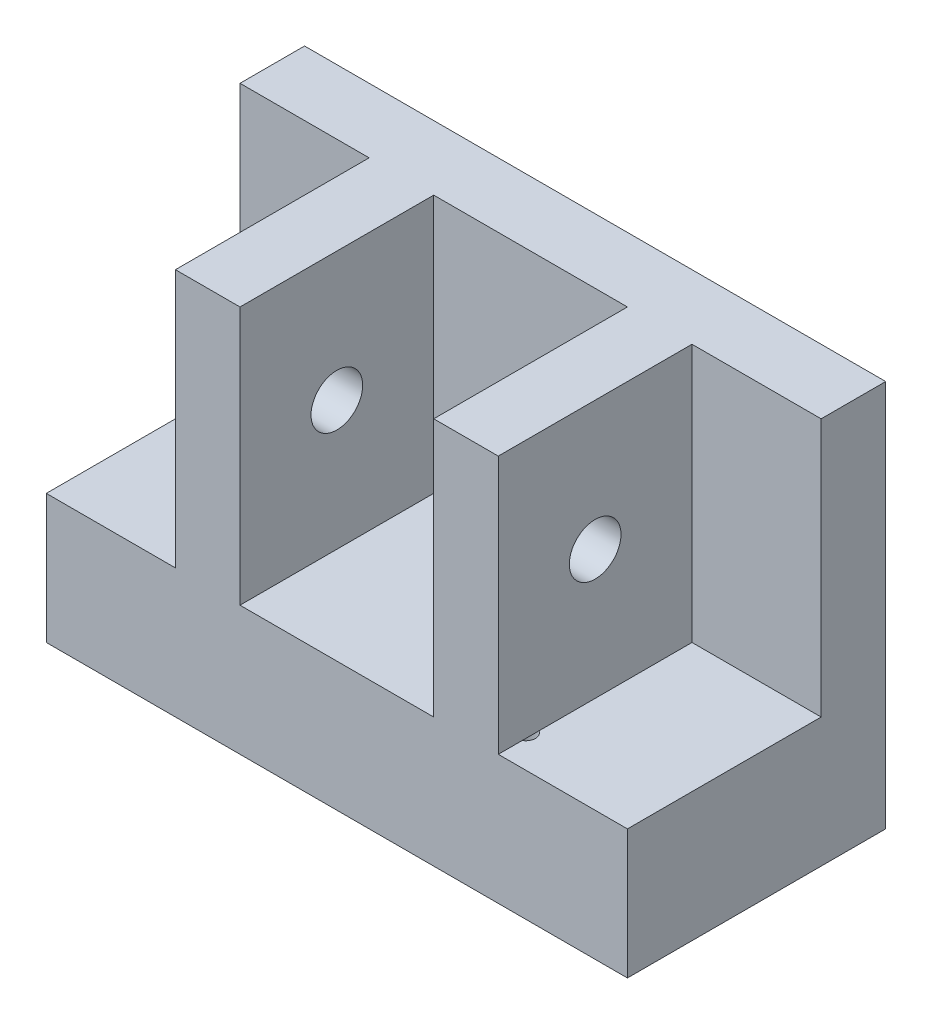
ISO-10303-21;
HEADER;
FILE_DESCRIPTION(('STEP AP214'),'2;1');
FILE_NAME('part.step','',(''),(''),'','','');
FILE_SCHEMA(('AUTOMOTIVE_DESIGN { 1 0 10303 214 1 1 1 1 }'));
ENDSEC;
DATA;
#1=APPLICATION_CONTEXT('core data for automotive mechanical design processes');
#2=APPLICATION_PROTOCOL_DEFINITION('international standard','automotive_design',2000,#1);
#3=PRODUCT_CONTEXT('',#1,'mechanical');
#4=PRODUCT('Part','Part','',(#3));
#5=PRODUCT_RELATED_PRODUCT_CATEGORY('part','',(#4));
#6=PRODUCT_DEFINITION_FORMATION('','',#4);
#7=PRODUCT_DEFINITION_CONTEXT('part definition',#1,'design');
#8=PRODUCT_DEFINITION('design','',#6,#7);
#9=PRODUCT_DEFINITION_SHAPE('','',#8);
#10=(LENGTH_UNIT() NAMED_UNIT(*) SI_UNIT(.MILLI.,.METRE.));
#11=(NAMED_UNIT(*) PLANE_ANGLE_UNIT() SI_UNIT($,.RADIAN.));
#12=(NAMED_UNIT(*) SI_UNIT($,.STERADIAN.) SOLID_ANGLE_UNIT());
#13=UNCERTAINTY_MEASURE_WITH_UNIT(LENGTH_MEASURE(1.E-05),#10,'distance_accuracy_value','');
#14=(GEOMETRIC_REPRESENTATION_CONTEXT(3) GLOBAL_UNCERTAINTY_ASSIGNED_CONTEXT((#13)) GLOBAL_UNIT_ASSIGNED_CONTEXT((#10,
#11,#12)) REPRESENTATION_CONTEXT('',''));
#15=CARTESIAN_POINT('',(0.,0.,0.));
#16=DIRECTION('',(0.,0.,1.));
#17=DIRECTION('',(1.,0.,0.));
#18=AXIS2_PLACEMENT_3D('',#15,#16,#17);
#19=CARTESIAN_POINT('',(0.,40.,-30.));
#20=DIRECTION('',(0.,0.,1.));
#21=DIRECTION('',(1.,0.,0.));
#22=AXIS2_PLACEMENT_3D('',#19,#20,#21);
#23=PLANE('',#22);
#24=DIRECTION('',(-1.,0.,0.));
#25=VECTOR('',#24,1.);
#26=CARTESIAN_POINT('',(0.,0.,-30.));
#27=LINE('',#26,#25);
#28=CARTESIAN_POINT('',(-25.,0.,-30.));
#29=VERTEX_POINT('',#28);
#30=CARTESIAN_POINT('',(-45.,0.,-30.));
#31=VERTEX_POINT('',#30);
#32=EDGE_CURVE('E183',#29,#31,#27,.T.);
#33=ORIENTED_EDGE('',*,*,#32,.F.);
#34=DIRECTION('',(0.,-1.,0.));
#35=VECTOR('',#34,1.);
#36=CARTESIAN_POINT('',(-25.,40.,-30.));
#37=LINE('',#36,#35);
#38=CARTESIAN_POINT('',(-25.,40.,-30.));
#39=VERTEX_POINT('',#38);
#40=EDGE_CURVE('E11',#39,#29,#37,.T.);
#41=ORIENTED_EDGE('',*,*,#40,.F.);
#42=DIRECTION('',(-1.,0.,0.));
#43=VECTOR('',#42,1.);
#44=CARTESIAN_POINT('',(0.,40.,-30.));
#45=LINE('',#44,#43);
#46=CARTESIAN_POINT('',(-45.,40.,-30.));
#47=VERTEX_POINT('',#46);
#48=EDGE_CURVE('E214',#39,#47,#45,.T.);
#49=ORIENTED_EDGE('',*,*,#48,.T.);
#50=DIRECTION('',(0.,-1.,0.));
#51=VECTOR('',#50,1.);
#52=CARTESIAN_POINT('',(-45.,40.,-30.));
#53=LINE('',#52,#51);
#54=EDGE_CURVE('E215',#47,#31,#53,.T.);
#55=ORIENTED_EDGE('',*,*,#54,.T.);
#56=EDGE_LOOP('',(#33,#41,#49,#55));
#57=FACE_BOUND('',#56,.T.);
#58=ADVANCED_FACE('F47',(#57),#23,.T.);
#59=CARTESIAN_POINT('',(-25.,40.,0.));
#60=DIRECTION('',(1.,0.,0.));
#61=DIRECTION('',(0.,0.,-1.));
#62=AXIS2_PLACEMENT_3D('',#59,#60,#61);
#63=PLANE('',#62);
#64=CARTESIAN_POINT('',(-25.,20.,-15.));
#65=DIRECTION('',(1.,0.,0.));
#66=DIRECTION('',(0.,0.,-1.));
#67=AXIS2_PLACEMENT_3D('',#64,#65,#66);
#68=CIRCLE('',#67,4.);
#69=CARTESIAN_POINT('',(-25.,20.,-19.));
#70=VERTEX_POINT('',#69);
#71=EDGE_CURVE('E278',#70,#70,#68,.T.);
#72=ORIENTED_EDGE('',*,*,#71,.T.);
#73=EDGE_LOOP('',(#72));
#74=FACE_BOUND('',#73,.T.);
#75=DIRECTION('',(0.,0.,1.));
#76=VECTOR('',#75,1.);
#77=CARTESIAN_POINT('',(-25.,0.,0.));
#78=LINE('',#77,#76);
#79=CARTESIAN_POINT('',(-25.,0.,-6.29903810567667));
#80=VERTEX_POINT('',#79);
#81=EDGE_CURVE('E185',#29,#80,#78,.T.);
#82=ORIENTED_EDGE('',*,*,#81,.T.);
#83=CARTESIAN_POINT('',(-25.,0.,-3.70096189432335));
#84=VERTEX_POINT('',#83);
#85=EDGE_CURVE('E161',#80,#84,#78,.T.);
#86=ORIENTED_EDGE('',*,*,#85,.T.);
#87=CARTESIAN_POINT('',(-25.,0.,0.));
#88=VERTEX_POINT('',#87);
#89=EDGE_CURVE('E175',#84,#88,#78,.T.);
#90=ORIENTED_EDGE('',*,*,#89,.T.);
#91=DIRECTION('',(0.,-1.,0.));
#92=VECTOR('',#91,1.);
#93=CARTESIAN_POINT('',(-25.,40.,0.));
#94=LINE('',#93,#92);
#95=CARTESIAN_POINT('',(-25.,40.,0.));
#96=VERTEX_POINT('',#95);
#97=EDGE_CURVE('E56',#96,#88,#94,.T.);
#98=ORIENTED_EDGE('',*,*,#97,.F.);
#99=DIRECTION('',(0.,0.,1.));
#100=VECTOR('',#99,1.);
#101=CARTESIAN_POINT('',(-25.,40.,0.));
#102=LINE('',#101,#100);
#103=EDGE_CURVE('E263',#39,#96,#102,.T.);
#104=ORIENTED_EDGE('',*,*,#103,.F.);
#105=ORIENTED_EDGE('',*,*,#40,.T.);
#106=EDGE_LOOP('',(#82,#86,#90,#98,#104,#105));
#107=FACE_BOUND('',#106,.T.);
#108=ADVANCED_FACE('F186',(#74,#107),#63,.F.);
#109=CARTESIAN_POINT('',(-15.,40.,0.));
#110=DIRECTION('',(-1.,0.,0.));
#111=DIRECTION('',(0.,0.,1.));
#112=AXIS2_PLACEMENT_3D('',#109,#110,#111);
#113=PLANE('',#112);
#114=CARTESIAN_POINT('',(-15.,20.,-15.));
#115=DIRECTION('',(-1.,0.,0.));
#116=DIRECTION('',(0.,0.,1.));
#117=AXIS2_PLACEMENT_3D('',#114,#115,#116);
#118=CIRCLE('',#117,4.);
#119=CARTESIAN_POINT('',(-15.,20.,-11.));
#120=VERTEX_POINT('',#119);
#121=EDGE_CURVE('E316',#120,#120,#118,.T.);
#122=ORIENTED_EDGE('',*,*,#121,.T.);
#123=EDGE_LOOP('',(#122));
#124=FACE_BOUND('',#123,.T.);
#125=DIRECTION('',(0.,0.,-1.));
#126=VECTOR('',#125,1.);
#127=CARTESIAN_POINT('',(-15.,0.,0.));
#128=LINE('',#127,#126);
#129=CARTESIAN_POINT('',(-15.,0.,0.));
#130=VERTEX_POINT('',#129);
#131=CARTESIAN_POINT('',(-15.,0.,-30.));
#132=VERTEX_POINT('',#131);
#133=EDGE_CURVE('E189',#130,#132,#128,.T.);
#134=ORIENTED_EDGE('',*,*,#133,.T.);
#135=DIRECTION('',(0.,-1.,0.));
#136=VECTOR('',#135,1.);
#137=CARTESIAN_POINT('',(-15.,40.,-30.));
#138=LINE('',#137,#136);
#139=CARTESIAN_POINT('',(-15.,40.,-30.));
#140=VERTEX_POINT('',#139);
#141=EDGE_CURVE('E246',#140,#132,#138,.T.);
#142=ORIENTED_EDGE('',*,*,#141,.F.);
#143=DIRECTION('',(0.,0.,-1.));
#144=VECTOR('',#143,1.);
#145=CARTESIAN_POINT('',(-15.,40.,0.));
#146=LINE('',#145,#144);
#147=CARTESIAN_POINT('',(-15.,40.,0.));
#148=VERTEX_POINT('',#147);
#149=EDGE_CURVE('E283',#148,#140,#146,.T.);
#150=ORIENTED_EDGE('',*,*,#149,.F.);
#151=DIRECTION('',(0.,-1.,0.));
#152=VECTOR('',#151,1.);
#153=CARTESIAN_POINT('',(-15.,40.,0.));
#154=LINE('',#153,#152);
#155=EDGE_CURVE('E250',#148,#130,#154,.T.);
#156=ORIENTED_EDGE('',*,*,#155,.T.);
#157=EDGE_LOOP('',(#134,#142,#150,#156));
#158=FACE_BOUND('',#157,.T.);
#159=ADVANCED_FACE('F407',(#124,#158),#113,.F.);
#160=CARTESIAN_POINT('',(0.,40.,-30.));
#161=DIRECTION('',(0.,0.,-1.));
#162=DIRECTION('',(-1.,0.,0.));
#163=AXIS2_PLACEMENT_3D('',#160,#161,#162);
#164=PLANE('',#163);
#165=DIRECTION('',(1.,0.,0.));
#166=VECTOR('',#165,1.);
#167=CARTESIAN_POINT('',(0.,0.,-30.));
#168=LINE('',#167,#166);
#169=CARTESIAN_POINT('',(15.,0.,-30.));
#170=VERTEX_POINT('',#169);
#171=EDGE_CURVE('E196',#132,#170,#168,.T.);
#172=ORIENTED_EDGE('',*,*,#171,.T.);
#173=DIRECTION('',(0.,-1.,0.));
#174=VECTOR('',#173,1.);
#175=CARTESIAN_POINT('',(15.,40.,-30.));
#176=LINE('',#175,#174);
#177=CARTESIAN_POINT('',(15.,40.,-30.));
#178=VERTEX_POINT('',#177);
#179=EDGE_CURVE('E242',#178,#170,#176,.T.);
#180=ORIENTED_EDGE('',*,*,#179,.F.);
#181=DIRECTION('',(1.,0.,0.));
#182=VECTOR('',#181,1.);
#183=CARTESIAN_POINT('',(0.,40.,-30.));
#184=LINE('',#183,#182);
#185=EDGE_CURVE('E286',#140,#178,#184,.T.);
#186=ORIENTED_EDGE('',*,*,#185,.F.);
#187=ORIENTED_EDGE('',*,*,#141,.T.);
#188=EDGE_LOOP('',(#172,#180,#186,#187));
#189=FACE_BOUND('',#188,.T.);
#190=ADVANCED_FACE('F403',(#189),#164,.F.);
#191=CARTESIAN_POINT('',(15.,40.,0.));
#192=DIRECTION('',(1.,0.,0.));
#193=DIRECTION('',(0.,0.,-1.));
#194=AXIS2_PLACEMENT_3D('',#191,#192,#193);
#195=PLANE('',#194);
#196=CARTESIAN_POINT('',(15.,20.,-15.));
#197=DIRECTION('',(1.,0.,0.));
#198=DIRECTION('',(0.,0.,-1.));
#199=AXIS2_PLACEMENT_3D('',#196,#197,#198);
#200=CIRCLE('',#199,4.);
#201=CARTESIAN_POINT('',(15.,20.,-19.));
#202=VERTEX_POINT('',#201);
#203=EDGE_CURVE('E321',#202,#202,#200,.T.);
#204=ORIENTED_EDGE('',*,*,#203,.T.);
#205=EDGE_LOOP('',(#204));
#206=FACE_BOUND('',#205,.T.);
#207=DIRECTION('',(0.,0.,1.));
#208=VECTOR('',#207,1.);
#209=CARTESIAN_POINT('',(15.,0.,0.));
#210=LINE('',#209,#208);
#211=CARTESIAN_POINT('',(15.,0.,0.));
#212=VERTEX_POINT('',#211);
#213=EDGE_CURVE('E200',#170,#212,#210,.T.);
#214=ORIENTED_EDGE('',*,*,#213,.T.);
#215=DIRECTION('',(0.,-1.,0.));
#216=VECTOR('',#215,1.);
#217=CARTESIAN_POINT('',(15.,40.,0.));
#218=LINE('',#217,#216);
#219=CARTESIAN_POINT('',(15.,40.,0.));
#220=VERTEX_POINT('',#219);
#221=EDGE_CURVE('E238',#220,#212,#218,.T.);
#222=ORIENTED_EDGE('',*,*,#221,.F.);
#223=DIRECTION('',(0.,0.,1.));
#224=VECTOR('',#223,1.);
#225=CARTESIAN_POINT('',(15.,40.,0.));
#226=LINE('',#225,#224);
#227=EDGE_CURVE('E289',#178,#220,#226,.T.);
#228=ORIENTED_EDGE('',*,*,#227,.F.);
#229=ORIENTED_EDGE('',*,*,#179,.T.);
#230=EDGE_LOOP('',(#214,#222,#228,#229));
#231=FACE_BOUND('',#230,.T.);
#232=ADVANCED_FACE('F400',(#206,#231),#195,.F.);
#233=CARTESIAN_POINT('',(0.,40.,0.));
#234=DIRECTION('',(0.,0.,-1.));
#235=DIRECTION('',(-1.,0.,0.));
#236=AXIS2_PLACEMENT_3D('',#233,#234,#235);
#237=PLANE('',#236);
#238=ORIENTED_EDGE('',*,*,#221,.T.);
#239=DIRECTION('',(-1.,0.,0.));
#240=VECTOR('',#239,1.);
#241=CARTESIAN_POINT('',(-45.,0.,0.));
#242=LINE('',#241,#240);
#243=EDGE_CURVE('E341',#212,#130,#242,.T.);
#244=ORIENTED_EDGE('',*,*,#243,.T.);
#245=ORIENTED_EDGE('',*,*,#155,.F.);
#246=DIRECTION('',(1.,0.,0.));
#247=VECTOR('',#246,1.);
#248=CARTESIAN_POINT('',(0.,40.,0.));
#249=LINE('',#248,#247);
#250=EDGE_CURVE('E261',#96,#148,#249,.T.);
#251=ORIENTED_EDGE('',*,*,#250,.F.);
#252=ORIENTED_EDGE('',*,*,#97,.T.);
#253=CARTESIAN_POINT('',(-45.,0.,0.));
#254=VERTEX_POINT('',#253);
#255=EDGE_CURVE('E178',#88,#254,#242,.T.);
#256=ORIENTED_EDGE('',*,*,#255,.T.);
#257=DIRECTION('',(0.,1.,0.));
#258=VECTOR('',#257,1.);
#259=CARTESIAN_POINT('',(-45.,-20.,0.));
#260=LINE('',#259,#258);
#261=CARTESIAN_POINT('',(-45.,-20.,0.));
#262=VERTEX_POINT('',#261);
#263=EDGE_CURVE('E332',#262,#254,#260,.T.);
#264=ORIENTED_EDGE('',*,*,#263,.F.);
#265=DIRECTION('',(-1.,0.,0.));
#266=VECTOR('',#265,1.);
#267=CARTESIAN_POINT('',(-45.,-20.,0.));
#268=LINE('',#267,#266);
#269=CARTESIAN_POINT('',(45.,-20.,0.));
#270=VERTEX_POINT('',#269);
#271=EDGE_CURVE('E335',#270,#262,#268,.T.);
#272=ORIENTED_EDGE('',*,*,#271,.F.);
#273=DIRECTION('',(0.,1.,0.));
#274=VECTOR('',#273,1.);
#275=CARTESIAN_POINT('',(45.,-20.,0.));
#276=LINE('',#275,#274);
#277=CARTESIAN_POINT('',(45.,0.,0.));
#278=VERTEX_POINT('',#277);
#279=EDGE_CURVE('E328',#270,#278,#276,.T.);
#280=ORIENTED_EDGE('',*,*,#279,.T.);
#281=CARTESIAN_POINT('',(25.,0.,0.));
#282=VERTEX_POINT('',#281);
#283=EDGE_CURVE('E336',#278,#282,#242,.T.);
#284=ORIENTED_EDGE('',*,*,#283,.T.);
#285=DIRECTION('',(0.,-1.,0.));
#286=VECTOR('',#285,1.);
#287=CARTESIAN_POINT('',(25.,40.,0.));
#288=LINE('',#287,#286);
#289=CARTESIAN_POINT('',(25.,40.,0.));
#290=VERTEX_POINT('',#289);
#291=EDGE_CURVE('E234',#290,#282,#288,.T.);
#292=ORIENTED_EDGE('',*,*,#291,.F.);
#293=DIRECTION('',(1.,0.,0.));
#294=VECTOR('',#293,1.);
#295=CARTESIAN_POINT('',(0.,40.,0.));
#296=LINE('',#295,#294);
#297=EDGE_CURVE('E292',#220,#290,#296,.T.);
#298=ORIENTED_EDGE('',*,*,#297,.F.);
#299=EDGE_LOOP('',(#238,#244,#245,#251,#252,#256,#264,#272,#280,#284,#292,#298));
#300=FACE_BOUND('',#299,.T.);
#301=ADVANCED_FACE('F257',(#300),#237,.F.);
#302=CARTESIAN_POINT('',(25.,40.,0.));
#303=DIRECTION('',(-1.,0.,0.));
#304=DIRECTION('',(0.,0.,1.));
#305=AXIS2_PLACEMENT_3D('',#302,#303,#304);
#306=PLANE('',#305);
#307=CARTESIAN_POINT('',(25.,20.,-15.));
#308=DIRECTION('',(-1.,0.,0.));
#309=DIRECTION('',(0.,0.,1.));
#310=AXIS2_PLACEMENT_3D('',#307,#308,#309);
#311=CIRCLE('',#310,4.);
#312=CARTESIAN_POINT('',(25.,20.,-11.));
#313=VERTEX_POINT('',#312);
#314=EDGE_CURVE('E50',#313,#313,#311,.T.);
#315=ORIENTED_EDGE('',*,*,#314,.T.);
#316=EDGE_LOOP('',(#315));
#317=FACE_BOUND('',#316,.T.);
#318=DIRECTION('',(0.,0.,-1.));
#319=VECTOR('',#318,1.);
#320=CARTESIAN_POINT('',(25.,0.,0.));
#321=LINE('',#320,#319);
#322=CARTESIAN_POINT('',(25.,0.,-3.70096189432335));
#323=VERTEX_POINT('',#322);
#324=EDGE_CURVE('E205',#282,#323,#321,.T.);
#325=ORIENTED_EDGE('',*,*,#324,.T.);
#326=CARTESIAN_POINT('',(25.,0.,-6.29903810567666));
#327=VERTEX_POINT('',#326);
#328=EDGE_CURVE('E210',#323,#327,#321,.T.);
#329=ORIENTED_EDGE('',*,*,#328,.T.);
#330=CARTESIAN_POINT('',(25.,0.,-30.));
#331=VERTEX_POINT('',#330);
#332=EDGE_CURVE('E204',#327,#331,#321,.T.);
#333=ORIENTED_EDGE('',*,*,#332,.T.);
#334=DIRECTION('',(0.,-1.,0.));
#335=VECTOR('',#334,1.);
#336=CARTESIAN_POINT('',(25.,40.,-30.));
#337=LINE('',#336,#335);
#338=CARTESIAN_POINT('',(25.,40.,-30.));
#339=VERTEX_POINT('',#338);
#340=EDGE_CURVE('E230',#339,#331,#337,.T.);
#341=ORIENTED_EDGE('',*,*,#340,.F.);
#342=DIRECTION('',(0.,0.,-1.));
#343=VECTOR('',#342,1.);
#344=CARTESIAN_POINT('',(25.,40.,0.));
#345=LINE('',#344,#343);
#346=EDGE_CURVE('E295',#290,#339,#345,.T.);
#347=ORIENTED_EDGE('',*,*,#346,.F.);
#348=ORIENTED_EDGE('',*,*,#291,.T.);
#349=EDGE_LOOP('',(#325,#329,#333,#341,#347,#348));
#350=FACE_BOUND('',#349,.T.);
#351=ADVANCED_FACE('F390',(#317,#350),#306,.F.);
#352=CARTESIAN_POINT('',(0.,40.,-30.));
#353=DIRECTION('',(0.,0.,-1.));
#354=DIRECTION('',(-1.,0.,0.));
#355=AXIS2_PLACEMENT_3D('',#352,#353,#354);
#356=PLANE('',#355);
#357=DIRECTION('',(1.,0.,0.));
#358=VECTOR('',#357,1.);
#359=CARTESIAN_POINT('',(0.,0.,-30.));
#360=LINE('',#359,#358);
#361=CARTESIAN_POINT('',(45.,0.,-30.));
#362=VERTEX_POINT('',#361);
#363=EDGE_CURVE('E209',#331,#362,#360,.T.);
#364=ORIENTED_EDGE('',*,*,#363,.T.);
#365=DIRECTION('',(0.,-1.,0.));
#366=VECTOR('',#365,1.);
#367=CARTESIAN_POINT('',(45.,40.,-30.));
#368=LINE('',#367,#366);
#369=CARTESIAN_POINT('',(45.,40.,-30.));
#370=VERTEX_POINT('',#369);
#371=EDGE_CURVE('E226',#370,#362,#368,.T.);
#372=ORIENTED_EDGE('',*,*,#371,.F.);
#373=DIRECTION('',(1.,0.,0.));
#374=VECTOR('',#373,1.);
#375=CARTESIAN_POINT('',(0.,40.,-30.));
#376=LINE('',#375,#374);
#377=EDGE_CURVE('E298',#339,#370,#376,.T.);
#378=ORIENTED_EDGE('',*,*,#377,.F.);
#379=ORIENTED_EDGE('',*,*,#340,.T.);
#380=EDGE_LOOP('',(#364,#372,#378,#379));
#381=FACE_BOUND('',#380,.T.);
#382=ADVANCED_FACE('F471',(#381),#356,.F.);
#383=CARTESIAN_POINT('',(45.,40.,0.));
#384=DIRECTION('',(-1.,0.,0.));
#385=DIRECTION('',(0.,0.,1.));
#386=AXIS2_PLACEMENT_3D('',#383,#384,#385);
#387=PLANE('',#386);
#388=ORIENTED_EDGE('',*,*,#371,.T.);
#389=DIRECTION('',(0.,0.,1.));
#390=VECTOR('',#389,1.);
#391=CARTESIAN_POINT('',(45.,0.,-40.));
#392=LINE('',#391,#390);
#393=EDGE_CURVE('E342',#362,#278,#392,.T.);
#394=ORIENTED_EDGE('',*,*,#393,.T.);
#395=ORIENTED_EDGE('',*,*,#279,.F.);
#396=DIRECTION('',(0.,0.,1.));
#397=VECTOR('',#396,1.);
#398=CARTESIAN_POINT('',(45.,-20.,-40.));
#399=LINE('',#398,#397);
#400=CARTESIAN_POINT('',(45.,-20.,-40.));
#401=VERTEX_POINT('',#400);
#402=EDGE_CURVE('E349',#401,#270,#399,.T.);
#403=ORIENTED_EDGE('',*,*,#402,.F.);
#404=DIRECTION('',(0.,-1.,0.));
#405=VECTOR('',#404,1.);
#406=CARTESIAN_POINT('',(45.,40.,-40.));
#407=LINE('',#406,#405);
#408=CARTESIAN_POINT('',(45.,40.,-40.));
#409=VERTEX_POINT('',#408);
#410=EDGE_CURVE('E223',#409,#401,#407,.T.);
#411=ORIENTED_EDGE('',*,*,#410,.F.);
#412=DIRECTION('',(0.,0.,-1.));
#413=VECTOR('',#412,1.);
#414=CARTESIAN_POINT('',(45.,40.,0.));
#415=LINE('',#414,#413);
#416=EDGE_CURVE('E301',#370,#409,#415,.T.);
#417=ORIENTED_EDGE('',*,*,#416,.F.);
#418=EDGE_LOOP('',(#388,#394,#395,#403,#411,#417));
#419=FACE_BOUND('',#418,.T.);
#420=ADVANCED_FACE('F481',(#419),#387,.F.);
#421=CARTESIAN_POINT('',(0.,40.,-40.));
#422=DIRECTION('',(0.,0.,-1.));
#423=DIRECTION('',(-1.,0.,0.));
#424=AXIS2_PLACEMENT_3D('',#421,#422,#423);
#425=PLANE('',#424);
#426=ORIENTED_EDGE('',*,*,#410,.T.);
#427=DIRECTION('',(1.,0.,0.));
#428=VECTOR('',#427,1.);
#429=CARTESIAN_POINT('',(-45.,-20.,-40.));
#430=LINE('',#429,#428);
#431=CARTESIAN_POINT('',(-45.,-20.,-40.));
#432=VERTEX_POINT('',#431);
#433=EDGE_CURVE('E352',#432,#401,#430,.T.);
#434=ORIENTED_EDGE('',*,*,#433,.F.);
#435=DIRECTION('',(0.,-1.,0.));
#436=VECTOR('',#435,1.);
#437=CARTESIAN_POINT('',(-45.,40.,-40.));
#438=LINE('',#437,#436);
#439=CARTESIAN_POINT('',(-45.,40.,-40.));
#440=VERTEX_POINT('',#439);
#441=EDGE_CURVE('E219',#440,#432,#438,.T.);
#442=ORIENTED_EDGE('',*,*,#441,.F.);
#443=DIRECTION('',(1.,0.,0.));
#444=VECTOR('',#443,1.);
#445=CARTESIAN_POINT('',(0.,40.,-40.));
#446=LINE('',#445,#444);
#447=EDGE_CURVE('E304',#440,#409,#446,.T.);
#448=ORIENTED_EDGE('',*,*,#447,.T.);
#449=EDGE_LOOP('',(#426,#434,#442,#448));
#450=FACE_BOUND('',#449,.T.);
#451=ADVANCED_FACE('F492',(#450),#425,.T.);
#452=CARTESIAN_POINT('',(-45.,40.,0.));
#453=DIRECTION('',(-1.,0.,0.));
#454=DIRECTION('',(0.,0.,1.));
#455=AXIS2_PLACEMENT_3D('',#452,#453,#454);
#456=PLANE('',#455);
#457=ORIENTED_EDGE('',*,*,#441,.T.);
#458=DIRECTION('',(0.,0.,-1.));
#459=VECTOR('',#458,1.);
#460=CARTESIAN_POINT('',(-45.,-20.,-40.));
#461=LINE('',#460,#459);
#462=EDGE_CURVE('E340',#262,#432,#461,.T.);
#463=ORIENTED_EDGE('',*,*,#462,.F.);
#464=ORIENTED_EDGE('',*,*,#263,.T.);
#465=DIRECTION('',(0.,0.,-1.));
#466=VECTOR('',#465,1.);
#467=CARTESIAN_POINT('',(-45.,0.,-40.));
#468=LINE('',#467,#466);
#469=EDGE_CURVE('E173',#254,#31,#468,.T.);
#470=ORIENTED_EDGE('',*,*,#469,.T.);
#471=ORIENTED_EDGE('',*,*,#54,.F.);
#472=DIRECTION('',(0.,0.,-1.));
#473=VECTOR('',#472,1.);
#474=CARTESIAN_POINT('',(-45.,40.,0.));
#475=LINE('',#474,#473);
#476=EDGE_CURVE('E220',#47,#440,#475,.T.);
#477=ORIENTED_EDGE('',*,*,#476,.T.);
#478=EDGE_LOOP('',(#457,#463,#464,#470,#471,#477));
#479=FACE_BOUND('',#478,.T.);
#480=ADVANCED_FACE('F309',(#479),#456,.T.);
#481=CARTESIAN_POINT('',(0.,40.,0.));
#482=DIRECTION('',(0.,1.,0.));
#483=DIRECTION('',(0.,0.,1.));
#484=AXIS2_PLACEMENT_3D('',#481,#482,#483);
#485=PLANE('',#484);
#486=ORIENTED_EDGE('',*,*,#48,.F.);
#487=ORIENTED_EDGE('',*,*,#103,.T.);
#488=ORIENTED_EDGE('',*,*,#250,.T.);
#489=ORIENTED_EDGE('',*,*,#149,.T.);
#490=ORIENTED_EDGE('',*,*,#185,.T.);
#491=ORIENTED_EDGE('',*,*,#227,.T.);
#492=ORIENTED_EDGE('',*,*,#297,.T.);
#493=ORIENTED_EDGE('',*,*,#346,.T.);
#494=ORIENTED_EDGE('',*,*,#377,.T.);
#495=ORIENTED_EDGE('',*,*,#416,.T.);
#496=ORIENTED_EDGE('',*,*,#447,.F.);
#497=ORIENTED_EDGE('',*,*,#476,.F.);
#498=EDGE_LOOP('',(#486,#487,#488,#489,#490,#491,#492,#493,#494,#495,#496,#497));
#499=FACE_BOUND('',#498,.T.);
#500=ADVANCED_FACE('F271',(#499),#485,.T.);
#501=CARTESIAN_POINT('',(-45.,20.,-15.));
#502=DIRECTION('',(1.,0.,0.));
#503=DIRECTION('',(0.,0.,-1.));
#504=AXIS2_PLACEMENT_3D('',#501,#502,#503);
#505=CYLINDRICAL_SURFACE('',#504,4.);
#506=ORIENTED_EDGE('',*,*,#314,.F.);
#507=EDGE_LOOP('',(#506));
#508=FACE_BOUND('',#507,.T.);
#509=ORIENTED_EDGE('',*,*,#203,.F.);
#510=EDGE_LOOP('',(#509));
#511=FACE_BOUND('',#510,.T.);
#512=ADVANCED_FACE('F415',(#508,#511),#505,.F.);
#513=ORIENTED_EDGE('',*,*,#121,.F.);
#514=EDGE_LOOP('',(#513));
#515=FACE_BOUND('',#514,.T.);
#516=ORIENTED_EDGE('',*,*,#71,.F.);
#517=EDGE_LOOP('',(#516));
#518=FACE_BOUND('',#517,.T.);
#519=ADVANCED_FACE('F418',(#515,#518),#505,.F.);
#520=CARTESIAN_POINT('',(0.,0.,0.));
#521=DIRECTION('',(0.,1.,0.));
#522=DIRECTION('',(0.,0.,1.));
#523=AXIS2_PLACEMENT_3D('',#520,#521,#522);
#524=PLANE('',#523);
#525=CARTESIAN_POINT('',(24.25,0.,-5.));
#526=DIRECTION('',(0.,-1.,0.));
#527=DIRECTION('',(0.,0.,-1.));
#528=AXIS2_PLACEMENT_3D('',#525,#526,#527);
#529=CIRCLE('',#528,1.5);
#530=EDGE_CURVE('E359',#327,#323,#529,.T.);
#531=ORIENTED_EDGE('',*,*,#530,.T.);
#532=ORIENTED_EDGE('',*,*,#324,.F.);
#533=ORIENTED_EDGE('',*,*,#283,.F.);
#534=ORIENTED_EDGE('',*,*,#393,.F.);
#535=ORIENTED_EDGE('',*,*,#363,.F.);
#536=ORIENTED_EDGE('',*,*,#332,.F.);
#537=EDGE_LOOP('',(#531,#532,#533,#534,#535,#536));
#538=FACE_BOUND('',#537,.T.);
#539=ADVANCED_FACE('F385',(#538),#524,.T.);
#540=ORIENTED_EDGE('',*,*,#213,.F.);
#541=ORIENTED_EDGE('',*,*,#171,.F.);
#542=ORIENTED_EDGE('',*,*,#133,.F.);
#543=ORIENTED_EDGE('',*,*,#243,.F.);
#544=EDGE_LOOP('',(#540,#541,#542,#543));
#545=FACE_BOUND('',#544,.T.);
#546=ADVANCED_FACE('F374',(#545),#524,.T.);
#547=CARTESIAN_POINT('',(0.,-20.,0.));
#548=DIRECTION('',(0.,1.,0.));
#549=DIRECTION('',(0.,0.,1.));
#550=AXIS2_PLACEMENT_3D('',#547,#548,#549);
#551=PLANE('',#550);
#552=CARTESIAN_POINT('',(-24.25,-20.,-5.00000000000001));
#553=DIRECTION('',(0.,-1.,0.));
#554=DIRECTION('',(0.,0.,-1.));
#555=AXIS2_PLACEMENT_3D('',#552,#553,#554);
#556=CIRCLE('',#555,1.5);
#557=CARTESIAN_POINT('',(-24.25,-20.,-6.50000000000001));
#558=VERTEX_POINT('',#557);
#559=EDGE_CURVE('E165',#558,#558,#556,.T.);
#560=ORIENTED_EDGE('',*,*,#559,.F.);
#561=EDGE_LOOP('',(#560));
#562=FACE_BOUND('',#561,.T.);
#563=CARTESIAN_POINT('',(24.25,-20.,-5.));
#564=DIRECTION('',(0.,-1.,0.));
#565=DIRECTION('',(0.,0.,-1.));
#566=AXIS2_PLACEMENT_3D('',#563,#564,#565);
#567=CIRCLE('',#566,1.5);
#568=CARTESIAN_POINT('',(24.25,-20.,-6.50000000000001));
#569=VERTEX_POINT('',#568);
#570=EDGE_CURVE('E363',#569,#569,#567,.T.);
#571=ORIENTED_EDGE('',*,*,#570,.F.);
#572=EDGE_LOOP('',(#571));
#573=FACE_BOUND('',#572,.T.);
#574=ORIENTED_EDGE('',*,*,#462,.T.);
#575=ORIENTED_EDGE('',*,*,#433,.T.);
#576=ORIENTED_EDGE('',*,*,#402,.T.);
#577=ORIENTED_EDGE('',*,*,#271,.T.);
#578=EDGE_LOOP('',(#574,#575,#576,#577));
#579=FACE_BOUND('',#578,.T.);
#580=ADVANCED_FACE('F371',(#562,#573,#579),#551,.F.);
#581=CARTESIAN_POINT('',(-24.25,0.,-5.00000000000001));
#582=DIRECTION('',(0.,-1.,0.));
#583=DIRECTION('',(0.,0.,-1.));
#584=AXIS2_PLACEMENT_3D('',#581,#582,#583);
#585=CIRCLE('',#584,1.5);
#586=EDGE_CURVE('E164',#84,#80,#585,.T.);
#587=ORIENTED_EDGE('',*,*,#586,.T.);
#588=ORIENTED_EDGE('',*,*,#81,.F.);
#589=ORIENTED_EDGE('',*,*,#32,.T.);
#590=ORIENTED_EDGE('',*,*,#469,.F.);
#591=ORIENTED_EDGE('',*,*,#255,.F.);
#592=ORIENTED_EDGE('',*,*,#89,.F.);
#593=EDGE_LOOP('',(#587,#588,#589,#590,#591,#592));
#594=FACE_BOUND('',#593,.T.);
#595=ADVANCED_FACE('F176',(#594),#524,.T.);
#596=CARTESIAN_POINT('',(-24.25,0.,-5.00000000000001));
#597=DIRECTION('',(0.,-1.,0.));
#598=DIRECTION('',(0.,0.,-1.));
#599=AXIS2_PLACEMENT_3D('',#596,#597,#598);
#600=PLANE('',#599);
#601=ORIENTED_EDGE('',*,*,#85,.F.);
#602=EDGE_CURVE('E69',#80,#84,#585,.T.);
#603=ORIENTED_EDGE('',*,*,#602,.T.);
#604=EDGE_LOOP('',(#601,#603));
#605=FACE_BOUND('',#604,.T.);
#606=ADVANCED_FACE('F159',(#605),#600,.T.);
#607=CARTESIAN_POINT('',(-24.25,0.,-5.00000000000001));
#608=DIRECTION('',(0.,-1.,0.));
#609=DIRECTION('',(0.,0.,-1.));
#610=AXIS2_PLACEMENT_3D('',#607,#608,#609);
#611=CYLINDRICAL_SURFACE('',#610,1.5);
#612=ORIENTED_EDGE('',*,*,#586,.F.);
#613=ORIENTED_EDGE('',*,*,#602,.F.);
#614=EDGE_LOOP('',(#612,#613));
#615=FACE_BOUND('',#614,.T.);
#616=ORIENTED_EDGE('',*,*,#559,.T.);
#617=EDGE_LOOP('',(#616));
#618=FACE_BOUND('',#617,.T.);
#619=ADVANCED_FACE('F168',(#615,#618),#611,.F.);
#620=CARTESIAN_POINT('',(24.25,0.,-5.));
#621=DIRECTION('',(0.,-1.,0.));
#622=DIRECTION('',(0.,0.,-1.));
#623=AXIS2_PLACEMENT_3D('',#620,#621,#622);
#624=PLANE('',#623);
#625=ORIENTED_EDGE('',*,*,#328,.F.);
#626=EDGE_CURVE('E62',#323,#327,#529,.T.);
#627=ORIENTED_EDGE('',*,*,#626,.T.);
#628=EDGE_LOOP('',(#625,#627));
#629=FACE_BOUND('',#628,.T.);
#630=ADVANCED_FACE('F586',(#629),#624,.T.);
#631=CARTESIAN_POINT('',(24.25,0.,-5.));
#632=DIRECTION('',(0.,-1.,0.));
#633=DIRECTION('',(0.,0.,-1.));
#634=AXIS2_PLACEMENT_3D('',#631,#632,#633);
#635=CYLINDRICAL_SURFACE('',#634,1.5);
#636=ORIENTED_EDGE('',*,*,#530,.F.);
#637=ORIENTED_EDGE('',*,*,#626,.F.);
#638=EDGE_LOOP('',(#636,#637));
#639=FACE_BOUND('',#638,.T.);
#640=ORIENTED_EDGE('',*,*,#570,.T.);
#641=EDGE_LOOP('',(#640));
#642=FACE_BOUND('',#641,.T.);
#643=ADVANCED_FACE('F594',(#639,#642),#635,.F.);
#644=CLOSED_SHELL('',(#58,#108,#159,#190,#232,#301,#351,#382,#420,#451,#480,#500,#512,#519,#539,
#546,#580,#595,#606,#619,#630,#643));
#645=MANIFOLD_SOLID_BREP('B2',#644);
#646=ADVANCED_BREP_SHAPE_REPRESENTATION('',(#18,#645),#14);
#647=SHAPE_DEFINITION_REPRESENTATION(#9,#646);
ENDSEC;
END-ISO-10303-21;
